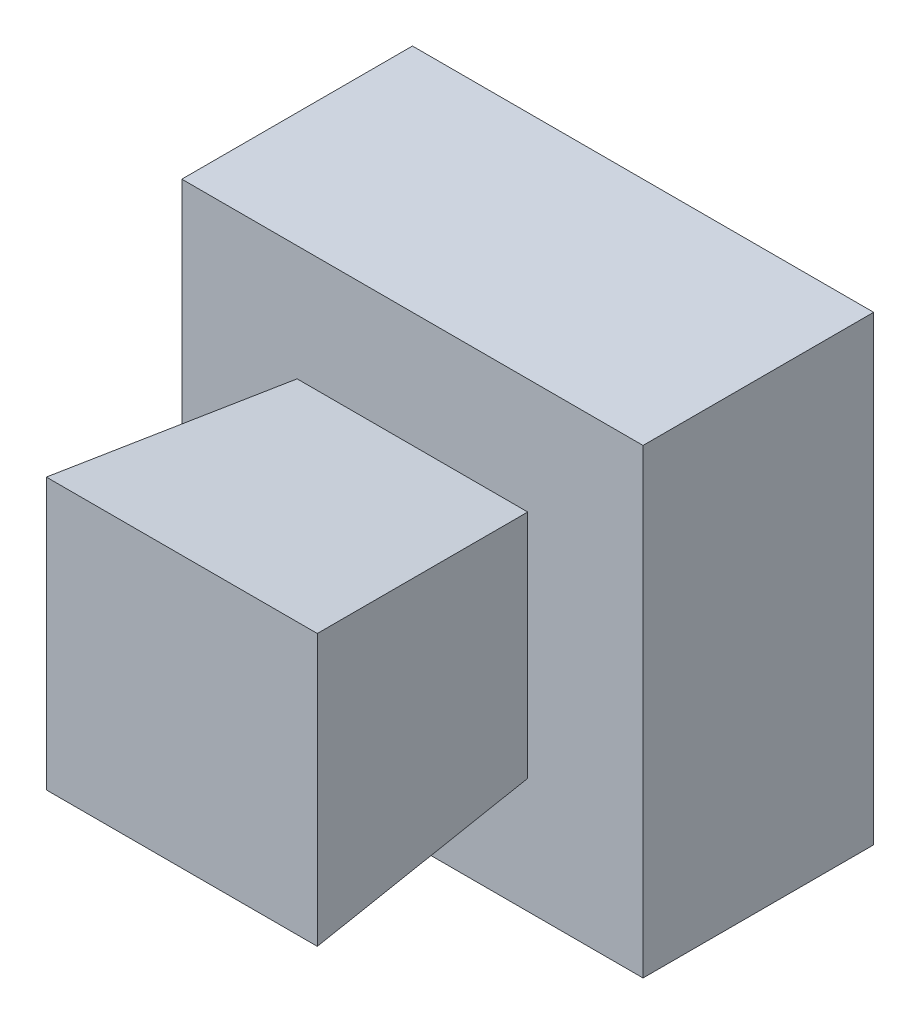
ISO-10303-21;
HEADER;
FILE_DESCRIPTION(('STEP AP214'),'2;1');
FILE_NAME('part.step','',(''),(''),'','','');
FILE_SCHEMA(('AUTOMOTIVE_DESIGN { 1 0 10303 214 1 1 1 1 }'));
ENDSEC;
DATA;
#1=APPLICATION_CONTEXT('core data for automotive mechanical design processes');
#2=APPLICATION_PROTOCOL_DEFINITION('international standard','automotive_design',2000,#1);
#3=PRODUCT_CONTEXT('',#1,'mechanical');
#4=PRODUCT('Part','Part','',(#3));
#5=PRODUCT_RELATED_PRODUCT_CATEGORY('part','',(#4));
#6=PRODUCT_DEFINITION_FORMATION('','',#4);
#7=PRODUCT_DEFINITION_CONTEXT('part definition',#1,'design');
#8=PRODUCT_DEFINITION('design','',#6,#7);
#9=PRODUCT_DEFINITION_SHAPE('','',#8);
#10=(LENGTH_UNIT() NAMED_UNIT(*) SI_UNIT(.MILLI.,.METRE.));
#11=(NAMED_UNIT(*) PLANE_ANGLE_UNIT() SI_UNIT($,.RADIAN.));
#12=(NAMED_UNIT(*) SI_UNIT($,.STERADIAN.) SOLID_ANGLE_UNIT());
#13=UNCERTAINTY_MEASURE_WITH_UNIT(LENGTH_MEASURE(1.E-05),#10,'distance_accuracy_value','');
#14=(GEOMETRIC_REPRESENTATION_CONTEXT(3) GLOBAL_UNCERTAINTY_ASSIGNED_CONTEXT((#13)) GLOBAL_UNIT_ASSIGNED_CONTEXT((#10,
#11,#12)) REPRESENTATION_CONTEXT('',''));
#15=CARTESIAN_POINT('',(0.,0.,0.));
#16=DIRECTION('',(0.,0.,1.));
#17=DIRECTION('',(1.,0.,0.));
#18=AXIS2_PLACEMENT_3D('',#15,#16,#17);
#19=CARTESIAN_POINT('',(0.,0.,10.));
#20=DIRECTION('',(0.,0.,-1.));
#21=DIRECTION('',(-1.,0.,0.));
#22=AXIS2_PLACEMENT_3D('',#19,#20,#21);
#23=PLANE('',#22);
#24=DIRECTION('',(0.,-1.,0.));
#25=VECTOR('',#24,1.);
#26=CARTESIAN_POINT('',(0.,0.,10.));
#27=LINE('',#26,#25);
#28=CARTESIAN_POINT('',(0.,20.,10.));
#29=VERTEX_POINT('',#28);
#30=CARTESIAN_POINT('',(0.,0.,10.));
#31=VERTEX_POINT('',#30);
#32=EDGE_CURVE('E137',#29,#31,#27,.T.);
#33=ORIENTED_EDGE('',*,*,#32,.T.);
#34=DIRECTION('',(1.,0.,0.));
#35=VECTOR('',#34,1.);
#36=CARTESIAN_POINT('',(0.,0.,10.));
#37=LINE('',#36,#35);
#38=CARTESIAN_POINT('',(20.,0.,10.));
#39=VERTEX_POINT('',#38);
#40=EDGE_CURVE('E140',#31,#39,#37,.T.);
#41=ORIENTED_EDGE('',*,*,#40,.T.);
#42=DIRECTION('',(0.,1.,0.));
#43=VECTOR('',#42,1.);
#44=CARTESIAN_POINT('',(20.,0.,10.));
#45=LINE('',#44,#43);
#46=CARTESIAN_POINT('',(20.,20.,10.));
#47=VERTEX_POINT('',#46);
#48=EDGE_CURVE('E141',#39,#47,#45,.T.);
#49=ORIENTED_EDGE('',*,*,#48,.T.);
#50=DIRECTION('',(-1.,0.,0.));
#51=VECTOR('',#50,1.);
#52=CARTESIAN_POINT('',(0.,20.,10.));
#53=LINE('',#52,#51);
#54=EDGE_CURVE('E144',#47,#29,#53,.T.);
#55=ORIENTED_EDGE('',*,*,#54,.T.);
#56=EDGE_LOOP('',(#33,#41,#49,#55));
#57=FACE_BOUND('',#56,.T.);
#58=DIRECTION('',(0.,-1.,0.));
#59=VECTOR('',#58,1.);
#60=CARTESIAN_POINT('',(5.,5.,10.));
#61=LINE('',#60,#59);
#62=CARTESIAN_POINT('',(5.,15.,10.));
#63=VERTEX_POINT('',#62);
#64=CARTESIAN_POINT('',(5.,5.,10.));
#65=VERTEX_POINT('',#64);
#66=EDGE_CURVE('E60',#63,#65,#61,.T.);
#67=ORIENTED_EDGE('',*,*,#66,.F.);
#68=DIRECTION('',(-1.,0.,0.));
#69=VECTOR('',#68,1.);
#70=CARTESIAN_POINT('',(5.,15.,10.));
#71=LINE('',#70,#69);
#72=CARTESIAN_POINT('',(15.,15.,10.));
#73=VERTEX_POINT('',#72);
#74=EDGE_CURVE('E63',#73,#63,#71,.T.);
#75=ORIENTED_EDGE('',*,*,#74,.F.);
#76=DIRECTION('',(0.,1.,0.));
#77=VECTOR('',#76,1.);
#78=CARTESIAN_POINT('',(15.,5.,10.));
#79=LINE('',#78,#77);
#80=CARTESIAN_POINT('',(15.,5.,10.));
#81=VERTEX_POINT('',#80);
#82=EDGE_CURVE('E105',#81,#73,#79,.T.);
#83=ORIENTED_EDGE('',*,*,#82,.F.);
#84=DIRECTION('',(1.,0.,0.));
#85=VECTOR('',#84,1.);
#86=CARTESIAN_POINT('',(5.,5.,10.));
#87=LINE('',#86,#85);
#88=EDGE_CURVE('E102',#65,#81,#87,.T.);
#89=ORIENTED_EDGE('',*,*,#88,.F.);
#90=EDGE_LOOP('',(#67,#75,#83,#89));
#91=FACE_BOUND('',#90,.T.);
#92=ADVANCED_FACE('F45',(#57,#91),#23,.F.);
#93=CARTESIAN_POINT('',(0.,0.,10.));
#94=DIRECTION('',(1.,0.,0.));
#95=DIRECTION('',(0.,0.,-1.));
#96=AXIS2_PLACEMENT_3D('',#93,#94,#95);
#97=PLANE('',#96);
#98=DIRECTION('',(0.,-1.,0.));
#99=VECTOR('',#98,1.);
#100=CARTESIAN_POINT('',(0.,0.,0.));
#101=LINE('',#100,#99);
#102=CARTESIAN_POINT('',(0.,20.,0.));
#103=VERTEX_POINT('',#102);
#104=CARTESIAN_POINT('',(0.,0.,0.));
#105=VERTEX_POINT('',#104);
#106=EDGE_CURVE('E121',#103,#105,#101,.T.);
#107=ORIENTED_EDGE('',*,*,#106,.T.);
#108=DIRECTION('',(0.,0.,-1.));
#109=VECTOR('',#108,1.);
#110=CARTESIAN_POINT('',(0.,0.,10.));
#111=LINE('',#110,#109);
#112=EDGE_CURVE('E11',#31,#105,#111,.T.);
#113=ORIENTED_EDGE('',*,*,#112,.F.);
#114=ORIENTED_EDGE('',*,*,#32,.F.);
#115=DIRECTION('',(0.,0.,-1.));
#116=VECTOR('',#115,1.);
#117=CARTESIAN_POINT('',(0.,20.,10.));
#118=LINE('',#117,#116);
#119=EDGE_CURVE('E150',#29,#103,#118,.T.);
#120=ORIENTED_EDGE('',*,*,#119,.T.);
#121=EDGE_LOOP('',(#107,#113,#114,#120));
#122=FACE_BOUND('',#121,.T.);
#123=ADVANCED_FACE('F42',(#122),#97,.F.);
#124=CARTESIAN_POINT('',(0.,0.,10.));
#125=DIRECTION('',(0.,1.,0.));
#126=DIRECTION('',(0.,0.,1.));
#127=AXIS2_PLACEMENT_3D('',#124,#125,#126);
#128=PLANE('',#127);
#129=DIRECTION('',(1.,0.,0.));
#130=VECTOR('',#129,1.);
#131=CARTESIAN_POINT('',(0.,0.,0.));
#132=LINE('',#131,#130);
#133=CARTESIAN_POINT('',(20.,0.,0.));
#134=VERTEX_POINT('',#133);
#135=EDGE_CURVE('E147',#105,#134,#132,.T.);
#136=ORIENTED_EDGE('',*,*,#135,.T.);
#137=DIRECTION('',(0.,0.,-1.));
#138=VECTOR('',#137,1.);
#139=CARTESIAN_POINT('',(20.,0.,10.));
#140=LINE('',#139,#138);
#141=EDGE_CURVE('E49',#39,#134,#140,.T.);
#142=ORIENTED_EDGE('',*,*,#141,.F.);
#143=ORIENTED_EDGE('',*,*,#40,.F.);
#144=ORIENTED_EDGE('',*,*,#112,.T.);
#145=EDGE_LOOP('',(#136,#142,#143,#144));
#146=FACE_BOUND('',#145,.T.);
#147=ADVANCED_FACE('F179',(#146),#128,.F.);
#148=CARTESIAN_POINT('',(20.,0.,10.));
#149=DIRECTION('',(-1.,0.,0.));
#150=DIRECTION('',(0.,0.,1.));
#151=AXIS2_PLACEMENT_3D('',#148,#149,#150);
#152=PLANE('',#151);
#153=DIRECTION('',(0.,1.,0.));
#154=VECTOR('',#153,1.);
#155=CARTESIAN_POINT('',(20.,0.,0.));
#156=LINE('',#155,#154);
#157=CARTESIAN_POINT('',(20.,20.,0.));
#158=VERTEX_POINT('',#157);
#159=EDGE_CURVE('E155',#134,#158,#156,.T.);
#160=ORIENTED_EDGE('',*,*,#159,.T.);
#161=DIRECTION('',(0.,0.,-1.));
#162=VECTOR('',#161,1.);
#163=CARTESIAN_POINT('',(20.,20.,10.));
#164=LINE('',#163,#162);
#165=EDGE_CURVE('E160',#47,#158,#164,.T.);
#166=ORIENTED_EDGE('',*,*,#165,.F.);
#167=ORIENTED_EDGE('',*,*,#48,.F.);
#168=ORIENTED_EDGE('',*,*,#141,.T.);
#169=EDGE_LOOP('',(#160,#166,#167,#168));
#170=FACE_BOUND('',#169,.T.);
#171=ADVANCED_FACE('F163',(#170),#152,.F.);
#172=CARTESIAN_POINT('',(0.,20.,10.));
#173=DIRECTION('',(0.,-1.,0.));
#174=DIRECTION('',(0.,0.,-1.));
#175=AXIS2_PLACEMENT_3D('',#172,#173,#174);
#176=PLANE('',#175);
#177=DIRECTION('',(-1.,0.,0.));
#178=VECTOR('',#177,1.);
#179=CARTESIAN_POINT('',(0.,20.,0.));
#180=LINE('',#179,#178);
#181=EDGE_CURVE('E143',#158,#103,#180,.T.);
#182=ORIENTED_EDGE('',*,*,#181,.T.);
#183=ORIENTED_EDGE('',*,*,#119,.F.);
#184=ORIENTED_EDGE('',*,*,#54,.F.);
#185=ORIENTED_EDGE('',*,*,#165,.T.);
#186=EDGE_LOOP('',(#182,#183,#184,#185));
#187=FACE_BOUND('',#186,.T.);
#188=ADVANCED_FACE('F172',(#187),#176,.F.);
#189=CARTESIAN_POINT('',(0.,0.,0.));
#190=DIRECTION('',(0.,0.,-1.));
#191=DIRECTION('',(-1.,0.,0.));
#192=AXIS2_PLACEMENT_3D('',#189,#190,#191);
#193=PLANE('',#192);
#194=ORIENTED_EDGE('',*,*,#106,.F.);
#195=ORIENTED_EDGE('',*,*,#181,.F.);
#196=ORIENTED_EDGE('',*,*,#159,.F.);
#197=ORIENTED_EDGE('',*,*,#135,.F.);
#198=EDGE_LOOP('',(#194,#195,#196,#197));
#199=FACE_BOUND('',#198,.T.);
#200=ADVANCED_FACE('F168',(#199),#193,.T.);
#201=CARTESIAN_POINT('',(5.,5.,10.));
#202=DIRECTION('',(-0.996194698091746,0.,-0.0871557427476582));
#203=DIRECTION('',(0.0871557427476582,0.,-0.996194698091746));
#204=AXIS2_PLACEMENT_3D('',#201,#202,#203);
#205=PLANE('',#204);
#206=ORIENTED_EDGE('',*,*,#66,.T.);
#207=DIRECTION('',(0.0868265938642476,0.0868265938642476,-0.992432509138967));
#208=VECTOR('',#207,1.);
#209=CARTESIAN_POINT('',(5.,5.,10.));
#210=LINE('',#209,#208);
#211=CARTESIAN_POINT('',(4.12511336474076,4.12511336474076,20.));
#212=VERTEX_POINT('',#211);
#213=EDGE_CURVE('E119',#212,#65,#210,.T.);
#214=ORIENTED_EDGE('',*,*,#213,.F.);
#215=DIRECTION('',(0.,1.,0.));
#216=VECTOR('',#215,1.);
#217=CARTESIAN_POINT('',(4.12511336474076,0.,20.));
#218=LINE('',#217,#216);
#219=CARTESIAN_POINT('',(4.12511336474076,15.8748866352592,20.));
#220=VERTEX_POINT('',#219);
#221=EDGE_CURVE('E129',#220,#212,#218,.F.);
#222=ORIENTED_EDGE('',*,*,#221,.F.);
#223=DIRECTION('',(0.0868265938642476,-0.0868265938642476,-0.992432509138967));
#224=VECTOR('',#223,1.);
#225=CARTESIAN_POINT('',(5.07538857402067,14.9246114259793,9.13830465591315));
#226=LINE('',#225,#224);
#227=EDGE_CURVE('E122',#220,#63,#226,.T.);
#228=ORIENTED_EDGE('',*,*,#227,.T.);
#229=EDGE_LOOP('',(#206,#214,#222,#228));
#230=FACE_BOUND('',#229,.T.);
#231=ADVANCED_FACE('F198',(#230),#205,.T.);
#232=CARTESIAN_POINT('',(5.,5.,10.));
#233=DIRECTION('',(0.,-0.996194698091746,-0.0871557427476582));
#234=DIRECTION('',(0.,0.0871557427476582,-0.996194698091746));
#235=AXIS2_PLACEMENT_3D('',#232,#233,#234);
#236=PLANE('',#235);
#237=ORIENTED_EDGE('',*,*,#88,.T.);
#238=DIRECTION('',(-0.0868265938642476,0.0868265938642476,-0.992432509138967));
#239=VECTOR('',#238,1.);
#240=CARTESIAN_POINT('',(15.,5.,10.));
#241=LINE('',#240,#239);
#242=CARTESIAN_POINT('',(15.8748866352592,4.12511336474076,20.));
#243=VERTEX_POINT('',#242);
#244=EDGE_CURVE('E111',#243,#81,#241,.T.);
#245=ORIENTED_EDGE('',*,*,#244,.F.);
#246=DIRECTION('',(-1.,0.,0.));
#247=VECTOR('',#246,1.);
#248=CARTESIAN_POINT('',(0.,4.12511336474076,20.));
#249=LINE('',#248,#247);
#250=EDGE_CURVE('E134',#212,#243,#249,.F.);
#251=ORIENTED_EDGE('',*,*,#250,.F.);
#252=ORIENTED_EDGE('',*,*,#213,.T.);
#253=EDGE_LOOP('',(#237,#245,#251,#252));
#254=FACE_BOUND('',#253,.T.);
#255=ADVANCED_FACE('F114',(#254),#236,.T.);
#256=CARTESIAN_POINT('',(15.,5.,10.));
#257=DIRECTION('',(0.996194698091746,0.,-0.0871557427476582));
#258=DIRECTION('',(-0.0871557427476582,0.,-0.996194698091746));
#259=AXIS2_PLACEMENT_3D('',#256,#257,#258);
#260=PLANE('',#259);
#261=ORIENTED_EDGE('',*,*,#82,.T.);
#262=DIRECTION('',(-0.0868265938642476,-0.0868265938642476,-0.992432509138967));
#263=VECTOR('',#262,1.);
#264=CARTESIAN_POINT('',(14.9246114259793,14.9246114259793,9.13830465591315));
#265=LINE('',#264,#263);
#266=CARTESIAN_POINT('',(15.8748866352592,15.8748866352592,20.));
#267=VERTEX_POINT('',#266);
#268=EDGE_CURVE('E123',#267,#73,#265,.T.);
#269=ORIENTED_EDGE('',*,*,#268,.F.);
#270=DIRECTION('',(0.,-1.,0.));
#271=VECTOR('',#270,1.);
#272=CARTESIAN_POINT('',(15.8748866352592,0.,20.));
#273=LINE('',#272,#271);
#274=EDGE_CURVE('E116',#243,#267,#273,.F.);
#275=ORIENTED_EDGE('',*,*,#274,.F.);
#276=ORIENTED_EDGE('',*,*,#244,.T.);
#277=EDGE_LOOP('',(#261,#269,#275,#276));
#278=FACE_BOUND('',#277,.T.);
#279=ADVANCED_FACE('F120',(#278),#260,.T.);
#280=CARTESIAN_POINT('',(5.,15.,10.));
#281=DIRECTION('',(0.,0.996194698091746,-0.0871557427476582));
#282=DIRECTION('',(0.,-0.0871557427476582,-0.996194698091746));
#283=AXIS2_PLACEMENT_3D('',#280,#281,#282);
#284=PLANE('',#283);
#285=ORIENTED_EDGE('',*,*,#74,.T.);
#286=ORIENTED_EDGE('',*,*,#227,.F.);
#287=DIRECTION('',(1.,0.,0.));
#288=VECTOR('',#287,1.);
#289=CARTESIAN_POINT('',(0.,15.8748866352592,20.));
#290=LINE('',#289,#288);
#291=EDGE_CURVE('E131',#267,#220,#290,.F.);
#292=ORIENTED_EDGE('',*,*,#291,.F.);
#293=ORIENTED_EDGE('',*,*,#268,.T.);
#294=EDGE_LOOP('',(#285,#286,#292,#293));
#295=FACE_BOUND('',#294,.T.);
#296=ADVANCED_FACE('F237',(#295),#284,.T.);
#297=CARTESIAN_POINT('',(0.,0.,20.));
#298=DIRECTION('',(0.,0.,-1.));
#299=DIRECTION('',(-1.,0.,0.));
#300=AXIS2_PLACEMENT_3D('',#297,#298,#299);
#301=PLANE('',#300);
#302=ORIENTED_EDGE('',*,*,#221,.T.);
#303=ORIENTED_EDGE('',*,*,#250,.T.);
#304=ORIENTED_EDGE('',*,*,#274,.T.);
#305=ORIENTED_EDGE('',*,*,#291,.T.);
#306=EDGE_LOOP('',(#302,#303,#304,#305));
#307=FACE_BOUND('',#306,.T.);
#308=ADVANCED_FACE('F245',(#307),#301,.F.);
#309=CLOSED_SHELL('',(#92,#123,#147,#171,#188,#200,#231,#255,#279,#296,#308));
#310=MANIFOLD_SOLID_BREP('B2',#309);
#311=ADVANCED_BREP_SHAPE_REPRESENTATION('',(#18,#310),#14);
#312=SHAPE_DEFINITION_REPRESENTATION(#9,#311);
ENDSEC;
END-ISO-10303-21;
